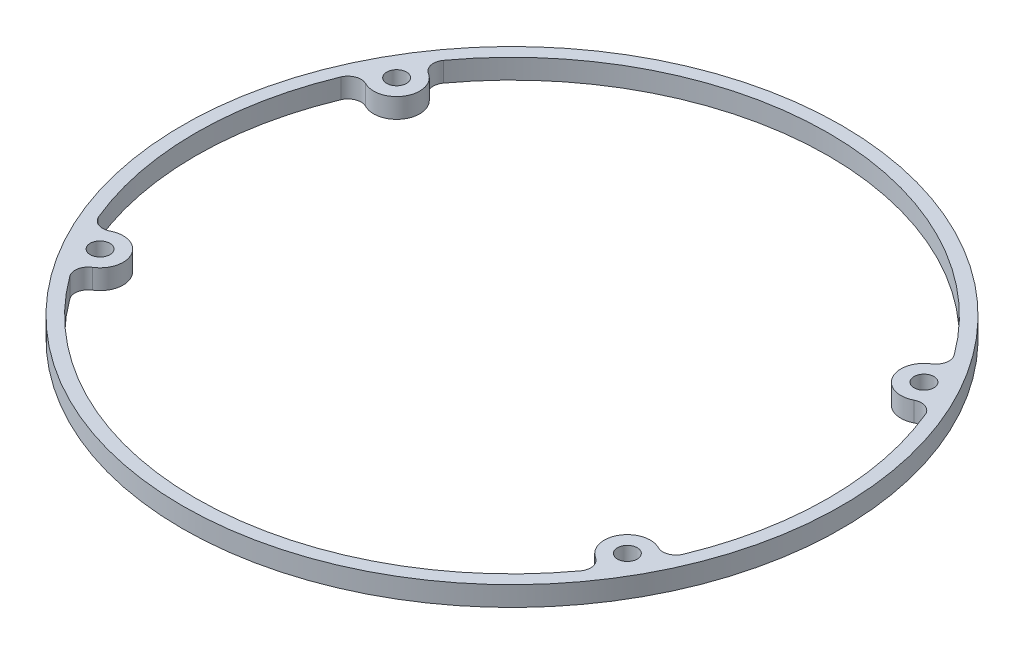
ISO-10303-21;
HEADER;
FILE_DESCRIPTION(('STEP AP214'),'2;1');
FILE_NAME('part.step','',(''),(''),'','','');
FILE_SCHEMA(('AUTOMOTIVE_DESIGN { 1 0 10303 214 1 1 1 1 }'));
ENDSEC;
DATA;
#1=APPLICATION_CONTEXT('core data for automotive mechanical design processes');
#2=APPLICATION_PROTOCOL_DEFINITION('international standard','automotive_design',2000,#1);
#3=PRODUCT_CONTEXT('',#1,'mechanical');
#4=PRODUCT('Part','Part','',(#3));
#5=PRODUCT_RELATED_PRODUCT_CATEGORY('part','',(#4));
#6=PRODUCT_DEFINITION_FORMATION('','',#4);
#7=PRODUCT_DEFINITION_CONTEXT('part definition',#1,'design');
#8=PRODUCT_DEFINITION('design','',#6,#7);
#9=PRODUCT_DEFINITION_SHAPE('','',#8);
#10=(LENGTH_UNIT() NAMED_UNIT(*) SI_UNIT(.MILLI.,.METRE.));
#11=(NAMED_UNIT(*) PLANE_ANGLE_UNIT() SI_UNIT($,.RADIAN.));
#12=(NAMED_UNIT(*) SI_UNIT($,.STERADIAN.) SOLID_ANGLE_UNIT());
#13=UNCERTAINTY_MEASURE_WITH_UNIT(LENGTH_MEASURE(1.E-05),#10,'distance_accuracy_value','');
#14=(GEOMETRIC_REPRESENTATION_CONTEXT(3) GLOBAL_UNCERTAINTY_ASSIGNED_CONTEXT((#13)) GLOBAL_UNIT_ASSIGNED_CONTEXT((#10,
#11,#12)) REPRESENTATION_CONTEXT('',''));
#15=CARTESIAN_POINT('',(0.,0.,0.));
#16=DIRECTION('',(0.,0.,1.));
#17=DIRECTION('',(1.,0.,0.));
#18=AXIS2_PLACEMENT_3D('',#15,#16,#17);
#19=CARTESIAN_POINT('',(0.,3.,0.));
#20=DIRECTION('',(0.,1.,0.));
#21=DIRECTION('',(0.,0.,1.));
#22=AXIS2_PLACEMENT_3D('',#19,#20,#21);
#23=PLANE('',#22);
#24=CARTESIAN_POINT('',(-40.,3.,22.5));
#25=DIRECTION('',(0.,1.,0.));
#26=DIRECTION('',(0.,0.,1.));
#27=AXIS2_PLACEMENT_3D('',#24,#25,#26);
#28=CIRCLE('',#27,1.5);
#29=CARTESIAN_POINT('',(-40.,3.,24.));
#30=VERTEX_POINT('',#29);
#31=EDGE_CURVE('E279',#30,#30,#28,.T.);
#32=ORIENTED_EDGE('',*,*,#31,.F.);
#33=EDGE_LOOP('',(#32));
#34=FACE_BOUND('',#33,.T.);
#35=CARTESIAN_POINT('',(40.,3.,-22.5));
#36=DIRECTION('',(0.,1.,0.));
#37=DIRECTION('',(0.,0.,1.));
#38=AXIS2_PLACEMENT_3D('',#35,#36,#37);
#39=CIRCLE('',#38,1.5);
#40=CARTESIAN_POINT('',(40.,3.,-21.));
#41=VERTEX_POINT('',#40);
#42=EDGE_CURVE('E291',#41,#41,#39,.T.);
#43=ORIENTED_EDGE('',*,*,#42,.F.);
#44=EDGE_LOOP('',(#43));
#45=FACE_BOUND('',#44,.T.);
#46=CARTESIAN_POINT('',(0.,3.,0.));
#47=DIRECTION('',(0.,1.,0.));
#48=DIRECTION('',(0.,0.,1.));
#49=AXIS2_PLACEMENT_3D('',#46,#47,#48);
#50=CIRCLE('',#49,50.);
#51=CARTESIAN_POINT('',(0.,3.,50.));
#52=VERTEX_POINT('',#51);
#53=EDGE_CURVE('E11',#52,#52,#50,.T.);
#54=ORIENTED_EDGE('',*,*,#53,.T.);
#55=EDGE_LOOP('',(#54));
#56=FACE_BOUND('',#55,.T.);
#57=CARTESIAN_POINT('',(-40.,3.,-22.5));
#58=DIRECTION('',(0.,1.,0.));
#59=DIRECTION('',(0.,0.,1.));
#60=AXIS2_PLACEMENT_3D('',#57,#58,#59);
#61=CIRCLE('',#60,1.5);
#62=CARTESIAN_POINT('',(-40.,3.,-21.));
#63=VERTEX_POINT('',#62);
#64=EDGE_CURVE('E297',#63,#63,#61,.T.);
#65=ORIENTED_EDGE('',*,*,#64,.F.);
#66=EDGE_LOOP('',(#65));
#67=FACE_BOUND('',#66,.T.);
#68=CARTESIAN_POINT('',(40.,3.,22.5));
#69=DIRECTION('',(0.,1.,0.));
#70=DIRECTION('',(0.,0.,1.));
#71=AXIS2_PLACEMENT_3D('',#68,#69,#70);
#72=CIRCLE('',#71,1.5);
#73=CARTESIAN_POINT('',(40.,3.,24.));
#74=VERTEX_POINT('',#73);
#75=EDGE_CURVE('E285',#74,#74,#72,.T.);
#76=ORIENTED_EDGE('',*,*,#75,.F.);
#77=EDGE_LOOP('',(#76));
#78=FACE_BOUND('',#77,.T.);
#79=CARTESIAN_POINT('',(37.1111285156196,3.,-27.1802159722318));
#80=DIRECTION('',(0.,-1.,0.));
#81=DIRECTION('',(0.,0.,1.));
#82=AXIS2_PLACEMENT_3D('',#79,#80,#81);
#83=CIRCLE('',#82,2.);
#84=CARTESIAN_POINT('',(38.7246558423857,3.,-28.3619644927636));
#85=VERTEX_POINT('',#84);
#86=CARTESIAN_POINT('',(38.1616272372125,3.,-25.4783192550566));
#87=VERTEX_POINT('',#86);
#88=EDGE_CURVE('E150',#85,#87,#83,.T.);
#89=ORIENTED_EDGE('',*,*,#88,.T.);
#90=CARTESIAN_POINT('',(40.,3.,-22.5));
#91=DIRECTION('',(0.,1.,0.));
#92=DIRECTION('',(0.,0.,-1.));
#93=AXIS2_PLACEMENT_3D('',#90,#91,#92);
#94=CIRCLE('',#93,3.49999999999998);
#95=CARTESIAN_POINT('',(41.5906252580667,3.,-19.382322773538));
#96=VERTEX_POINT('',#95);
#97=EDGE_CURVE('E159',#87,#96,#94,.T.);
#98=ORIENTED_EDGE('',*,*,#97,.T.);
#99=CARTESIAN_POINT('',(42.499553976962,3.,-17.6007929298454));
#100=DIRECTION('',(0.,-1.,0.));
#101=DIRECTION('',(0.,0.,-1.));
#102=AXIS2_PLACEMENT_3D('',#99,#100,#101);
#103=CIRCLE('',#102,2.);
#104=CARTESIAN_POINT('',(44.3473606716125,3.,-18.3660447963604));
#105=VERTEX_POINT('',#104);
#106=EDGE_CURVE('E50',#96,#105,#103,.T.);
#107=ORIENTED_EDGE('',*,*,#106,.T.);
#108=CARTESIAN_POINT('',(0.,3.,0.));
#109=DIRECTION('',(0.,-1.,0.));
#110=DIRECTION('',(0.,0.,-1.));
#111=AXIS2_PLACEMENT_3D('',#108,#109,#110);
#112=CIRCLE('',#111,48.);
#113=CARTESIAN_POINT('',(44.3473606716125,3.,18.3660447963604));
#114=VERTEX_POINT('',#113);
#115=EDGE_CURVE('E172',#105,#114,#112,.T.);
#116=ORIENTED_EDGE('',*,*,#115,.T.);
#117=CARTESIAN_POINT('',(42.499553976962,3.,17.6007929298454));
#118=DIRECTION('',(0.,-1.,0.));
#119=DIRECTION('',(0.,0.,1.));
#120=AXIS2_PLACEMENT_3D('',#117,#118,#119);
#121=CIRCLE('',#120,2.);
#122=CARTESIAN_POINT('',(41.5906252580667,3.,19.382322773538));
#123=VERTEX_POINT('',#122);
#124=EDGE_CURVE('E175',#114,#123,#121,.T.);
#125=ORIENTED_EDGE('',*,*,#124,.T.);
#126=CARTESIAN_POINT('',(40.,3.,22.5));
#127=DIRECTION('',(0.,1.,0.));
#128=DIRECTION('',(0.,0.,-1.));
#129=AXIS2_PLACEMENT_3D('',#126,#127,#128);
#130=CIRCLE('',#129,3.49999999999998);
#131=CARTESIAN_POINT('',(38.1616272372125,3.,25.4783192550566));
#132=VERTEX_POINT('',#131);
#133=EDGE_CURVE('E178',#123,#132,#130,.T.);
#134=ORIENTED_EDGE('',*,*,#133,.T.);
#135=CARTESIAN_POINT('',(37.1111285156196,3.,27.1802159722318));
#136=DIRECTION('',(0.,-1.,0.));
#137=DIRECTION('',(0.,0.,-1.));
#138=AXIS2_PLACEMENT_3D('',#135,#136,#137);
#139=CIRCLE('',#138,2.);
#140=CARTESIAN_POINT('',(38.7246558423857,3.,28.3619644927636));
#141=VERTEX_POINT('',#140);
#142=EDGE_CURVE('E181',#132,#141,#139,.T.);
#143=ORIENTED_EDGE('',*,*,#142,.T.);
#144=CARTESIAN_POINT('',(0.,3.,0.));
#145=DIRECTION('',(0.,-1.,0.));
#146=DIRECTION('',(0.,0.,-1.));
#147=AXIS2_PLACEMENT_3D('',#144,#145,#146);
#148=CIRCLE('',#147,48.);
#149=CARTESIAN_POINT('',(-38.7246558423857,3.,28.3619644927636));
#150=VERTEX_POINT('',#149);
#151=EDGE_CURVE('E184',#141,#150,#148,.T.);
#152=ORIENTED_EDGE('',*,*,#151,.T.);
#153=CARTESIAN_POINT('',(-37.1111285156196,3.,27.1802159722318));
#154=DIRECTION('',(0.,-1.,0.));
#155=DIRECTION('',(0.,0.,1.));
#156=AXIS2_PLACEMENT_3D('',#153,#154,#155);
#157=CIRCLE('',#156,2.);
#158=CARTESIAN_POINT('',(-38.1616272372125,3.,25.4783192550566));
#159=VERTEX_POINT('',#158);
#160=EDGE_CURVE('E187',#150,#159,#157,.T.);
#161=ORIENTED_EDGE('',*,*,#160,.T.);
#162=CARTESIAN_POINT('',(-40.,3.,22.5));
#163=DIRECTION('',(0.,1.,0.));
#164=DIRECTION('',(0.,0.,-1.));
#165=AXIS2_PLACEMENT_3D('',#162,#163,#164);
#166=CIRCLE('',#165,3.49999999999997);
#167=CARTESIAN_POINT('',(-41.5906252580667,3.,19.382322773538));
#168=VERTEX_POINT('',#167);
#169=EDGE_CURVE('E190',#159,#168,#166,.T.);
#170=ORIENTED_EDGE('',*,*,#169,.T.);
#171=CARTESIAN_POINT('',(-42.499553976962,3.,17.6007929298454));
#172=DIRECTION('',(0.,-1.,0.));
#173=DIRECTION('',(0.,0.,-1.));
#174=AXIS2_PLACEMENT_3D('',#171,#172,#173);
#175=CIRCLE('',#174,2.);
#176=CARTESIAN_POINT('',(-44.3473606716125,3.,18.3660447963604));
#177=VERTEX_POINT('',#176);
#178=EDGE_CURVE('E193',#168,#177,#175,.T.);
#179=ORIENTED_EDGE('',*,*,#178,.T.);
#180=CARTESIAN_POINT('',(0.,3.,0.));
#181=DIRECTION('',(0.,-1.,0.));
#182=DIRECTION('',(0.,0.,-1.));
#183=AXIS2_PLACEMENT_3D('',#180,#181,#182);
#184=CIRCLE('',#183,48.);
#185=CARTESIAN_POINT('',(-44.3473606716125,3.,-18.3660447963604));
#186=VERTEX_POINT('',#185);
#187=EDGE_CURVE('E196',#177,#186,#184,.T.);
#188=ORIENTED_EDGE('',*,*,#187,.T.);
#189=CARTESIAN_POINT('',(-42.499553976962,3.,-17.6007929298454));
#190=DIRECTION('',(0.,-1.,0.));
#191=DIRECTION('',(0.,0.,1.));
#192=AXIS2_PLACEMENT_3D('',#189,#190,#191);
#193=CIRCLE('',#192,2.);
#194=CARTESIAN_POINT('',(-41.5906252580667,3.,-19.382322773538));
#195=VERTEX_POINT('',#194);
#196=EDGE_CURVE('E199',#186,#195,#193,.T.);
#197=ORIENTED_EDGE('',*,*,#196,.T.);
#198=CARTESIAN_POINT('',(-40.,3.,-22.5));
#199=DIRECTION('',(0.,1.,0.));
#200=DIRECTION('',(0.,0.,-1.));
#201=AXIS2_PLACEMENT_3D('',#198,#199,#200);
#202=CIRCLE('',#201,3.49999999999997);
#203=CARTESIAN_POINT('',(-38.1616272372125,3.,-25.4783192550566));
#204=VERTEX_POINT('',#203);
#205=EDGE_CURVE('E202',#195,#204,#202,.T.);
#206=ORIENTED_EDGE('',*,*,#205,.T.);
#207=CARTESIAN_POINT('',(-37.1111285156196,3.,-27.1802159722318));
#208=DIRECTION('',(0.,-1.,0.));
#209=DIRECTION('',(0.,0.,-1.));
#210=AXIS2_PLACEMENT_3D('',#207,#208,#209);
#211=CIRCLE('',#210,2.);
#212=CARTESIAN_POINT('',(-38.7246558423857,3.,-28.3619644927636));
#213=VERTEX_POINT('',#212);
#214=EDGE_CURVE('E205',#204,#213,#211,.T.);
#215=ORIENTED_EDGE('',*,*,#214,.T.);
#216=CARTESIAN_POINT('',(0.,3.,0.));
#217=DIRECTION('',(0.,-1.,0.));
#218=DIRECTION('',(0.,0.,-1.));
#219=AXIS2_PLACEMENT_3D('',#216,#217,#218);
#220=CIRCLE('',#219,48.);
#221=EDGE_CURVE('E156',#213,#85,#220,.T.);
#222=ORIENTED_EDGE('',*,*,#221,.T.);
#223=EDGE_LOOP('',(#89,#98,#107,#116,#125,#134,#143,#152,#161,#170,#179,#188,#197,#206,#215,#222));
#224=FACE_BOUND('',#223,.T.);
#225=ADVANCED_FACE('F35',(#34,#45,#56,#67,#78,#224),#23,.T.);
#226=CARTESIAN_POINT('',(0.,0.,0.));
#227=DIRECTION('',(0.,1.,0.));
#228=DIRECTION('',(0.,0.,1.));
#229=AXIS2_PLACEMENT_3D('',#226,#227,#228);
#230=PLANE('',#229);
#231=CARTESIAN_POINT('',(0.,0.,0.));
#232=DIRECTION('',(0.,1.,0.));
#233=DIRECTION('',(0.,0.,1.));
#234=AXIS2_PLACEMENT_3D('',#231,#232,#233);
#235=CIRCLE('',#234,50.);
#236=CARTESIAN_POINT('',(0.,0.,50.));
#237=VERTEX_POINT('',#236);
#238=EDGE_CURVE('E39',#237,#237,#235,.T.);
#239=ORIENTED_EDGE('',*,*,#238,.F.);
#240=EDGE_LOOP('',(#239));
#241=FACE_BOUND('',#240,.T.);
#242=CARTESIAN_POINT('',(-40.,0.,-22.5));
#243=DIRECTION('',(0.,1.,0.));
#244=DIRECTION('',(0.,0.,1.));
#245=AXIS2_PLACEMENT_3D('',#242,#243,#244);
#246=CIRCLE('',#245,1.5);
#247=CARTESIAN_POINT('',(-40.,0.,-21.));
#248=VERTEX_POINT('',#247);
#249=EDGE_CURVE('E294',#248,#248,#246,.T.);
#250=ORIENTED_EDGE('',*,*,#249,.T.);
#251=EDGE_LOOP('',(#250));
#252=FACE_BOUND('',#251,.T.);
#253=CARTESIAN_POINT('',(40.,0.,-22.5));
#254=DIRECTION('',(0.,1.,0.));
#255=DIRECTION('',(0.,0.,1.));
#256=AXIS2_PLACEMENT_3D('',#253,#254,#255);
#257=CIRCLE('',#256,1.5);
#258=CARTESIAN_POINT('',(40.,0.,-21.));
#259=VERTEX_POINT('',#258);
#260=EDGE_CURVE('E288',#259,#259,#257,.T.);
#261=ORIENTED_EDGE('',*,*,#260,.T.);
#262=EDGE_LOOP('',(#261));
#263=FACE_BOUND('',#262,.T.);
#264=CARTESIAN_POINT('',(40.,0.,22.5));
#265=DIRECTION('',(0.,1.,0.));
#266=DIRECTION('',(0.,0.,1.));
#267=AXIS2_PLACEMENT_3D('',#264,#265,#266);
#268=CIRCLE('',#267,1.5);
#269=CARTESIAN_POINT('',(40.,0.,24.));
#270=VERTEX_POINT('',#269);
#271=EDGE_CURVE('E282',#270,#270,#268,.T.);
#272=ORIENTED_EDGE('',*,*,#271,.T.);
#273=EDGE_LOOP('',(#272));
#274=FACE_BOUND('',#273,.T.);
#275=CARTESIAN_POINT('',(-40.,0.,22.5));
#276=DIRECTION('',(0.,1.,0.));
#277=DIRECTION('',(0.,0.,1.));
#278=AXIS2_PLACEMENT_3D('',#275,#276,#277);
#279=CIRCLE('',#278,1.5);
#280=CARTESIAN_POINT('',(-40.,0.,24.));
#281=VERTEX_POINT('',#280);
#282=EDGE_CURVE('E251',#281,#281,#279,.T.);
#283=ORIENTED_EDGE('',*,*,#282,.T.);
#284=EDGE_LOOP('',(#283));
#285=FACE_BOUND('',#284,.T.);
#286=CARTESIAN_POINT('',(40.,0.,-22.5));
#287=DIRECTION('',(0.,1.,0.));
#288=DIRECTION('',(0.,0.,-1.));
#289=AXIS2_PLACEMENT_3D('',#286,#287,#288);
#290=CIRCLE('',#289,3.49999999999998);
#291=CARTESIAN_POINT('',(38.1616272372125,0.,-25.4783192550566));
#292=VERTEX_POINT('',#291);
#293=CARTESIAN_POINT('',(41.5906252580667,0.,-19.382322773538));
#294=VERTEX_POINT('',#293);
#295=EDGE_CURVE('E209',#292,#294,#290,.T.);
#296=ORIENTED_EDGE('',*,*,#295,.F.);
#297=CARTESIAN_POINT('',(37.1111285156196,0.,-27.1802159722318));
#298=DIRECTION('',(0.,-1.,0.));
#299=DIRECTION('',(0.,0.,1.));
#300=AXIS2_PLACEMENT_3D('',#297,#298,#299);
#301=CIRCLE('',#300,2.);
#302=CARTESIAN_POINT('',(38.7246558423857,0.,-28.3619644927636));
#303=VERTEX_POINT('',#302);
#304=EDGE_CURVE('E58',#303,#292,#301,.T.);
#305=ORIENTED_EDGE('',*,*,#304,.F.);
#306=CARTESIAN_POINT('',(0.,0.,0.));
#307=DIRECTION('',(0.,-1.,0.));
#308=DIRECTION('',(0.,0.,-1.));
#309=AXIS2_PLACEMENT_3D('',#306,#307,#308);
#310=CIRCLE('',#309,48.);
#311=CARTESIAN_POINT('',(-38.7246558423857,0.,-28.3619644927636));
#312=VERTEX_POINT('',#311);
#313=EDGE_CURVE('E165',#312,#303,#310,.T.);
#314=ORIENTED_EDGE('',*,*,#313,.F.);
#315=CARTESIAN_POINT('',(-37.1111285156196,0.,-27.1802159722318));
#316=DIRECTION('',(0.,-1.,0.));
#317=DIRECTION('',(0.,0.,-1.));
#318=AXIS2_PLACEMENT_3D('',#315,#316,#317);
#319=CIRCLE('',#318,2.);
#320=CARTESIAN_POINT('',(-38.1616272372125,0.,-25.4783192550566));
#321=VERTEX_POINT('',#320);
#322=EDGE_CURVE('E168',#321,#312,#319,.T.);
#323=ORIENTED_EDGE('',*,*,#322,.F.);
#324=CARTESIAN_POINT('',(-40.,0.,-22.5));
#325=DIRECTION('',(0.,1.,0.));
#326=DIRECTION('',(0.,0.,-1.));
#327=AXIS2_PLACEMENT_3D('',#324,#325,#326);
#328=CIRCLE('',#327,3.49999999999997);
#329=CARTESIAN_POINT('',(-41.5906252580667,0.,-19.382322773538));
#330=VERTEX_POINT('',#329);
#331=EDGE_CURVE('E244',#330,#321,#328,.T.);
#332=ORIENTED_EDGE('',*,*,#331,.F.);
#333=CARTESIAN_POINT('',(-42.499553976962,0.,-17.6007929298454));
#334=DIRECTION('',(0.,-1.,0.));
#335=DIRECTION('',(0.,0.,1.));
#336=AXIS2_PLACEMENT_3D('',#333,#334,#335);
#337=CIRCLE('',#336,2.);
#338=CARTESIAN_POINT('',(-44.3473606716125,0.,-18.3660447963604));
#339=VERTEX_POINT('',#338);
#340=EDGE_CURVE('E241',#339,#330,#337,.T.);
#341=ORIENTED_EDGE('',*,*,#340,.F.);
#342=CARTESIAN_POINT('',(0.,0.,0.));
#343=DIRECTION('',(0.,-1.,0.));
#344=DIRECTION('',(0.,0.,-1.));
#345=AXIS2_PLACEMENT_3D('',#342,#343,#344);
#346=CIRCLE('',#345,48.);
#347=CARTESIAN_POINT('',(-44.3473606716125,0.,18.3660447963604));
#348=VERTEX_POINT('',#347);
#349=EDGE_CURVE('E238',#348,#339,#346,.T.);
#350=ORIENTED_EDGE('',*,*,#349,.F.);
#351=CARTESIAN_POINT('',(-42.499553976962,0.,17.6007929298454));
#352=DIRECTION('',(0.,-1.,0.));
#353=DIRECTION('',(0.,0.,-1.));
#354=AXIS2_PLACEMENT_3D('',#351,#352,#353);
#355=CIRCLE('',#354,2.);
#356=CARTESIAN_POINT('',(-41.5906252580667,0.,19.382322773538));
#357=VERTEX_POINT('',#356);
#358=EDGE_CURVE('E235',#357,#348,#355,.T.);
#359=ORIENTED_EDGE('',*,*,#358,.F.);
#360=CARTESIAN_POINT('',(-40.,0.,22.5));
#361=DIRECTION('',(0.,1.,0.));
#362=DIRECTION('',(0.,0.,-1.));
#363=AXIS2_PLACEMENT_3D('',#360,#361,#362);
#364=CIRCLE('',#363,3.49999999999997);
#365=CARTESIAN_POINT('',(-38.1616272372125,0.,25.4783192550566));
#366=VERTEX_POINT('',#365);
#367=EDGE_CURVE('E232',#366,#357,#364,.T.);
#368=ORIENTED_EDGE('',*,*,#367,.F.);
#369=CARTESIAN_POINT('',(-37.1111285156196,0.,27.1802159722318));
#370=DIRECTION('',(0.,-1.,0.));
#371=DIRECTION('',(0.,0.,1.));
#372=AXIS2_PLACEMENT_3D('',#369,#370,#371);
#373=CIRCLE('',#372,2.);
#374=CARTESIAN_POINT('',(-38.7246558423857,0.,28.3619644927636));
#375=VERTEX_POINT('',#374);
#376=EDGE_CURVE('E229',#375,#366,#373,.T.);
#377=ORIENTED_EDGE('',*,*,#376,.F.);
#378=CARTESIAN_POINT('',(0.,0.,0.));
#379=DIRECTION('',(0.,-1.,0.));
#380=DIRECTION('',(0.,0.,-1.));
#381=AXIS2_PLACEMENT_3D('',#378,#379,#380);
#382=CIRCLE('',#381,48.);
#383=CARTESIAN_POINT('',(38.7246558423857,0.,28.3619644927636));
#384=VERTEX_POINT('',#383);
#385=EDGE_CURVE('E226',#384,#375,#382,.T.);
#386=ORIENTED_EDGE('',*,*,#385,.F.);
#387=CARTESIAN_POINT('',(37.1111285156196,0.,27.1802159722318));
#388=DIRECTION('',(0.,-1.,0.));
#389=DIRECTION('',(0.,0.,-1.));
#390=AXIS2_PLACEMENT_3D('',#387,#388,#389);
#391=CIRCLE('',#390,2.);
#392=CARTESIAN_POINT('',(38.1616272372125,0.,25.4783192550566));
#393=VERTEX_POINT('',#392);
#394=EDGE_CURVE('E223',#393,#384,#391,.T.);
#395=ORIENTED_EDGE('',*,*,#394,.F.);
#396=CARTESIAN_POINT('',(40.,0.,22.5));
#397=DIRECTION('',(0.,1.,0.));
#398=DIRECTION('',(0.,0.,-1.));
#399=AXIS2_PLACEMENT_3D('',#396,#397,#398);
#400=CIRCLE('',#399,3.49999999999998);
#401=CARTESIAN_POINT('',(41.5906252580667,0.,19.382322773538));
#402=VERTEX_POINT('',#401);
#403=EDGE_CURVE('E220',#402,#393,#400,.T.);
#404=ORIENTED_EDGE('',*,*,#403,.F.);
#405=CARTESIAN_POINT('',(42.499553976962,0.,17.6007929298454));
#406=DIRECTION('',(0.,-1.,0.));
#407=DIRECTION('',(0.,0.,1.));
#408=AXIS2_PLACEMENT_3D('',#405,#406,#407);
#409=CIRCLE('',#408,2.);
#410=CARTESIAN_POINT('',(44.3473606716125,0.,18.3660447963604));
#411=VERTEX_POINT('',#410);
#412=EDGE_CURVE('E217',#411,#402,#409,.T.);
#413=ORIENTED_EDGE('',*,*,#412,.F.);
#414=CARTESIAN_POINT('',(0.,0.,0.));
#415=DIRECTION('',(0.,-1.,0.));
#416=DIRECTION('',(0.,0.,-1.));
#417=AXIS2_PLACEMENT_3D('',#414,#415,#416);
#418=CIRCLE('',#417,48.);
#419=CARTESIAN_POINT('',(44.3473606716125,0.,-18.3660447963604));
#420=VERTEX_POINT('',#419);
#421=EDGE_CURVE('E214',#420,#411,#418,.T.);
#422=ORIENTED_EDGE('',*,*,#421,.F.);
#423=CARTESIAN_POINT('',(42.499553976962,0.,-17.6007929298454));
#424=DIRECTION('',(0.,-1.,0.));
#425=DIRECTION('',(0.,0.,-1.));
#426=AXIS2_PLACEMENT_3D('',#423,#424,#425);
#427=CIRCLE('',#426,2.);
#428=EDGE_CURVE('E211',#294,#420,#427,.T.);
#429=ORIENTED_EDGE('',*,*,#428,.F.);
#430=EDGE_LOOP('',(#296,#305,#314,#323,#332,#341,#350,#359,#368,#377,#386,#395,#404,#413,#422,#429));
#431=FACE_BOUND('',#430,.T.);
#432=ADVANCED_FACE('F303',(#241,#252,#263,#274,#285,#431),#230,.F.);
#433=CARTESIAN_POINT('',(0.,3.,0.));
#434=DIRECTION('',(0.,-1.,0.));
#435=DIRECTION('',(0.,0.,-1.));
#436=AXIS2_PLACEMENT_3D('',#433,#434,#435);
#437=CYLINDRICAL_SURFACE('',#436,50.);
#438=ORIENTED_EDGE('',*,*,#53,.F.);
#439=EDGE_LOOP('',(#438));
#440=FACE_BOUND('',#439,.T.);
#441=ORIENTED_EDGE('',*,*,#238,.T.);
#442=EDGE_LOOP('',(#441));
#443=FACE_BOUND('',#442,.T.);
#444=ADVANCED_FACE('F37',(#440,#443),#437,.T.);
#445=CARTESIAN_POINT('',(-40.,3.,-22.5));
#446=DIRECTION('',(0.,-1.,0.));
#447=DIRECTION('',(0.,0.,-1.));
#448=AXIS2_PLACEMENT_3D('',#445,#446,#447);
#449=CYLINDRICAL_SURFACE('',#448,1.5);
#450=ORIENTED_EDGE('',*,*,#64,.T.);
#451=EDGE_LOOP('',(#450));
#452=FACE_BOUND('',#451,.T.);
#453=ORIENTED_EDGE('',*,*,#249,.F.);
#454=EDGE_LOOP('',(#453));
#455=FACE_BOUND('',#454,.T.);
#456=ADVANCED_FACE('F306',(#452,#455),#449,.F.);
#457=CARTESIAN_POINT('',(40.,3.,-22.5));
#458=DIRECTION('',(0.,-1.,0.));
#459=DIRECTION('',(0.,0.,-1.));
#460=AXIS2_PLACEMENT_3D('',#457,#458,#459);
#461=CYLINDRICAL_SURFACE('',#460,1.5);
#462=ORIENTED_EDGE('',*,*,#42,.T.);
#463=EDGE_LOOP('',(#462));
#464=FACE_BOUND('',#463,.T.);
#465=ORIENTED_EDGE('',*,*,#260,.F.);
#466=EDGE_LOOP('',(#465));
#467=FACE_BOUND('',#466,.T.);
#468=ADVANCED_FACE('F308',(#464,#467),#461,.F.);
#469=CARTESIAN_POINT('',(40.,3.,22.5));
#470=DIRECTION('',(0.,-1.,0.));
#471=DIRECTION('',(0.,0.,-1.));
#472=AXIS2_PLACEMENT_3D('',#469,#470,#471);
#473=CYLINDRICAL_SURFACE('',#472,1.5);
#474=ORIENTED_EDGE('',*,*,#75,.T.);
#475=EDGE_LOOP('',(#474));
#476=FACE_BOUND('',#475,.T.);
#477=ORIENTED_EDGE('',*,*,#271,.F.);
#478=EDGE_LOOP('',(#477));
#479=FACE_BOUND('',#478,.T.);
#480=ADVANCED_FACE('F315',(#476,#479),#473,.F.);
#481=CARTESIAN_POINT('',(-40.,3.,22.5));
#482=DIRECTION('',(0.,-1.,0.));
#483=DIRECTION('',(0.,0.,-1.));
#484=AXIS2_PLACEMENT_3D('',#481,#482,#483);
#485=CYLINDRICAL_SURFACE('',#484,1.5);
#486=ORIENTED_EDGE('',*,*,#31,.T.);
#487=EDGE_LOOP('',(#486));
#488=FACE_BOUND('',#487,.T.);
#489=ORIENTED_EDGE('',*,*,#282,.F.);
#490=EDGE_LOOP('',(#489));
#491=FACE_BOUND('',#490,.T.);
#492=ADVANCED_FACE('F338',(#488,#491),#485,.F.);
#493=CARTESIAN_POINT('',(37.1111285156196,3.,-27.1802159722318));
#494=DIRECTION('',(0.,-1.,0.));
#495=DIRECTION('',(0.,0.,-1.));
#496=AXIS2_PLACEMENT_3D('',#493,#494,#495);
#497=CYLINDRICAL_SURFACE('',#496,2.);
#498=ORIENTED_EDGE('',*,*,#304,.T.);
#499=DIRECTION('',(0.,-1.,0.));
#500=VECTOR('',#499,1.);
#501=CARTESIAN_POINT('',(38.1616272372125,3.,-25.4783192550566));
#502=LINE('',#501,#500);
#503=EDGE_CURVE('E146',#87,#292,#502,.T.);
#504=ORIENTED_EDGE('',*,*,#503,.F.);
#505=ORIENTED_EDGE('',*,*,#88,.F.);
#506=DIRECTION('',(0.,-1.,0.));
#507=VECTOR('',#506,1.);
#508=CARTESIAN_POINT('',(38.7246558423857,3.,-28.3619644927636));
#509=LINE('',#508,#507);
#510=EDGE_CURVE('E249',#85,#303,#509,.T.);
#511=ORIENTED_EDGE('',*,*,#510,.T.);
#512=EDGE_LOOP('',(#498,#504,#505,#511));
#513=FACE_BOUND('',#512,.T.);
#514=ADVANCED_FACE('F148',(#513),#497,.F.);
#515=CARTESIAN_POINT('',(0.,3.,0.));
#516=DIRECTION('',(0.,-1.,0.));
#517=DIRECTION('',(0.,0.,-1.));
#518=AXIS2_PLACEMENT_3D('',#515,#516,#517);
#519=CYLINDRICAL_SURFACE('',#518,48.);
#520=ORIENTED_EDGE('',*,*,#313,.T.);
#521=ORIENTED_EDGE('',*,*,#510,.F.);
#522=ORIENTED_EDGE('',*,*,#221,.F.);
#523=DIRECTION('',(0.,-1.,0.));
#524=VECTOR('',#523,1.);
#525=CARTESIAN_POINT('',(-38.7246558423857,3.,-28.3619644927636));
#526=LINE('',#525,#524);
#527=EDGE_CURVE('E252',#213,#312,#526,.T.);
#528=ORIENTED_EDGE('',*,*,#527,.T.);
#529=EDGE_LOOP('',(#520,#521,#522,#528));
#530=FACE_BOUND('',#529,.T.);
#531=ADVANCED_FACE('F397',(#530),#519,.F.);
#532=CARTESIAN_POINT('',(-37.1111285156196,3.,-27.1802159722318));
#533=DIRECTION('',(0.,-1.,0.));
#534=DIRECTION('',(0.,0.,-1.));
#535=AXIS2_PLACEMENT_3D('',#532,#533,#534);
#536=CYLINDRICAL_SURFACE('',#535,2.);
#537=ORIENTED_EDGE('',*,*,#322,.T.);
#538=ORIENTED_EDGE('',*,*,#527,.F.);
#539=ORIENTED_EDGE('',*,*,#214,.F.);
#540=DIRECTION('',(0.,-1.,0.));
#541=VECTOR('',#540,1.);
#542=CARTESIAN_POINT('',(-38.1616272372125,3.,-25.4783192550566));
#543=LINE('',#542,#541);
#544=EDGE_CURVE('E254',#204,#321,#543,.T.);
#545=ORIENTED_EDGE('',*,*,#544,.T.);
#546=EDGE_LOOP('',(#537,#538,#539,#545));
#547=FACE_BOUND('',#546,.T.);
#548=ADVANCED_FACE('F395',(#547),#536,.F.);
#549=CARTESIAN_POINT('',(-40.,3.,-22.5));
#550=DIRECTION('',(0.,-1.,0.));
#551=DIRECTION('',(0.,0.,-1.));
#552=AXIS2_PLACEMENT_3D('',#549,#550,#551);
#553=CYLINDRICAL_SURFACE('',#552,3.49999999999997);
#554=ORIENTED_EDGE('',*,*,#331,.T.);
#555=ORIENTED_EDGE('',*,*,#544,.F.);
#556=ORIENTED_EDGE('',*,*,#205,.F.);
#557=DIRECTION('',(0.,-1.,0.));
#558=VECTOR('',#557,1.);
#559=CARTESIAN_POINT('',(-41.5906252580667,3.,-19.382322773538));
#560=LINE('',#559,#558);
#561=EDGE_CURVE('E256',#195,#330,#560,.T.);
#562=ORIENTED_EDGE('',*,*,#561,.T.);
#563=EDGE_LOOP('',(#554,#555,#556,#562));
#564=FACE_BOUND('',#563,.T.);
#565=ADVANCED_FACE('F391',(#564),#553,.T.);
#566=CARTESIAN_POINT('',(-42.499553976962,3.,-17.6007929298454));
#567=DIRECTION('',(0.,-1.,0.));
#568=DIRECTION('',(0.,0.,-1.));
#569=AXIS2_PLACEMENT_3D('',#566,#567,#568);
#570=CYLINDRICAL_SURFACE('',#569,2.);
#571=ORIENTED_EDGE('',*,*,#340,.T.);
#572=ORIENTED_EDGE('',*,*,#561,.F.);
#573=ORIENTED_EDGE('',*,*,#196,.F.);
#574=DIRECTION('',(0.,-1.,0.));
#575=VECTOR('',#574,1.);
#576=CARTESIAN_POINT('',(-44.3473606716125,3.,-18.3660447963604));
#577=LINE('',#576,#575);
#578=EDGE_CURVE('E258',#186,#339,#577,.T.);
#579=ORIENTED_EDGE('',*,*,#578,.T.);
#580=EDGE_LOOP('',(#571,#572,#573,#579));
#581=FACE_BOUND('',#580,.T.);
#582=ADVANCED_FACE('F387',(#581),#570,.F.);
#583=CARTESIAN_POINT('',(0.,3.,0.));
#584=DIRECTION('',(0.,-1.,0.));
#585=DIRECTION('',(0.,0.,-1.));
#586=AXIS2_PLACEMENT_3D('',#583,#584,#585);
#587=CYLINDRICAL_SURFACE('',#586,48.);
#588=ORIENTED_EDGE('',*,*,#349,.T.);
#589=ORIENTED_EDGE('',*,*,#578,.F.);
#590=ORIENTED_EDGE('',*,*,#187,.F.);
#591=DIRECTION('',(0.,-1.,0.));
#592=VECTOR('',#591,1.);
#593=CARTESIAN_POINT('',(-44.3473606716125,3.,18.3660447963604));
#594=LINE('',#593,#592);
#595=EDGE_CURVE('E260',#177,#348,#594,.T.);
#596=ORIENTED_EDGE('',*,*,#595,.T.);
#597=EDGE_LOOP('',(#588,#589,#590,#596));
#598=FACE_BOUND('',#597,.T.);
#599=ADVANCED_FACE('F383',(#598),#587,.F.);
#600=CARTESIAN_POINT('',(-42.499553976962,3.,17.6007929298454));
#601=DIRECTION('',(0.,-1.,0.));
#602=DIRECTION('',(0.,0.,-1.));
#603=AXIS2_PLACEMENT_3D('',#600,#601,#602);
#604=CYLINDRICAL_SURFACE('',#603,2.);
#605=ORIENTED_EDGE('',*,*,#358,.T.);
#606=ORIENTED_EDGE('',*,*,#595,.F.);
#607=ORIENTED_EDGE('',*,*,#178,.F.);
#608=DIRECTION('',(0.,-1.,0.));
#609=VECTOR('',#608,1.);
#610=CARTESIAN_POINT('',(-41.5906252580667,3.,19.382322773538));
#611=LINE('',#610,#609);
#612=EDGE_CURVE('E262',#168,#357,#611,.T.);
#613=ORIENTED_EDGE('',*,*,#612,.T.);
#614=EDGE_LOOP('',(#605,#606,#607,#613));
#615=FACE_BOUND('',#614,.T.);
#616=ADVANCED_FACE('F379',(#615),#604,.F.);
#617=CARTESIAN_POINT('',(-40.,3.,22.5));
#618=DIRECTION('',(0.,-1.,0.));
#619=DIRECTION('',(0.,0.,-1.));
#620=AXIS2_PLACEMENT_3D('',#617,#618,#619);
#621=CYLINDRICAL_SURFACE('',#620,3.49999999999997);
#622=ORIENTED_EDGE('',*,*,#367,.T.);
#623=ORIENTED_EDGE('',*,*,#612,.F.);
#624=ORIENTED_EDGE('',*,*,#169,.F.);
#625=DIRECTION('',(0.,-1.,0.));
#626=VECTOR('',#625,1.);
#627=CARTESIAN_POINT('',(-38.1616272372125,3.,25.4783192550566));
#628=LINE('',#627,#626);
#629=EDGE_CURVE('E264',#159,#366,#628,.T.);
#630=ORIENTED_EDGE('',*,*,#629,.T.);
#631=EDGE_LOOP('',(#622,#623,#624,#630));
#632=FACE_BOUND('',#631,.T.);
#633=ADVANCED_FACE('F375',(#632),#621,.T.);
#634=CARTESIAN_POINT('',(-37.1111285156196,3.,27.1802159722318));
#635=DIRECTION('',(0.,-1.,0.));
#636=DIRECTION('',(0.,0.,-1.));
#637=AXIS2_PLACEMENT_3D('',#634,#635,#636);
#638=CYLINDRICAL_SURFACE('',#637,2.);
#639=ORIENTED_EDGE('',*,*,#376,.T.);
#640=ORIENTED_EDGE('',*,*,#629,.F.);
#641=ORIENTED_EDGE('',*,*,#160,.F.);
#642=DIRECTION('',(0.,-1.,0.));
#643=VECTOR('',#642,1.);
#644=CARTESIAN_POINT('',(-38.7246558423857,3.,28.3619644927636));
#645=LINE('',#644,#643);
#646=EDGE_CURVE('E266',#150,#375,#645,.T.);
#647=ORIENTED_EDGE('',*,*,#646,.T.);
#648=EDGE_LOOP('',(#639,#640,#641,#647));
#649=FACE_BOUND('',#648,.T.);
#650=ADVANCED_FACE('F371',(#649),#638,.F.);
#651=CARTESIAN_POINT('',(0.,3.,0.));
#652=DIRECTION('',(0.,-1.,0.));
#653=DIRECTION('',(0.,0.,-1.));
#654=AXIS2_PLACEMENT_3D('',#651,#652,#653);
#655=CYLINDRICAL_SURFACE('',#654,48.);
#656=ORIENTED_EDGE('',*,*,#385,.T.);
#657=ORIENTED_EDGE('',*,*,#646,.F.);
#658=ORIENTED_EDGE('',*,*,#151,.F.);
#659=DIRECTION('',(0.,-1.,0.));
#660=VECTOR('',#659,1.);
#661=CARTESIAN_POINT('',(38.7246558423857,3.,28.3619644927636));
#662=LINE('',#661,#660);
#663=EDGE_CURVE('E268',#141,#384,#662,.T.);
#664=ORIENTED_EDGE('',*,*,#663,.T.);
#665=EDGE_LOOP('',(#656,#657,#658,#664));
#666=FACE_BOUND('',#665,.T.);
#667=ADVANCED_FACE('F367',(#666),#655,.F.);
#668=CARTESIAN_POINT('',(37.1111285156196,3.,27.1802159722318));
#669=DIRECTION('',(0.,-1.,0.));
#670=DIRECTION('',(0.,0.,-1.));
#671=AXIS2_PLACEMENT_3D('',#668,#669,#670);
#672=CYLINDRICAL_SURFACE('',#671,2.);
#673=ORIENTED_EDGE('',*,*,#394,.T.);
#674=ORIENTED_EDGE('',*,*,#663,.F.);
#675=ORIENTED_EDGE('',*,*,#142,.F.);
#676=DIRECTION('',(0.,-1.,0.));
#677=VECTOR('',#676,1.);
#678=CARTESIAN_POINT('',(38.1616272372125,3.,25.4783192550566));
#679=LINE('',#678,#677);
#680=EDGE_CURVE('E270',#132,#393,#679,.T.);
#681=ORIENTED_EDGE('',*,*,#680,.T.);
#682=EDGE_LOOP('',(#673,#674,#675,#681));
#683=FACE_BOUND('',#682,.T.);
#684=ADVANCED_FACE('F363',(#683),#672,.F.);
#685=CARTESIAN_POINT('',(40.,3.,22.5));
#686=DIRECTION('',(0.,-1.,0.));
#687=DIRECTION('',(0.,0.,-1.));
#688=AXIS2_PLACEMENT_3D('',#685,#686,#687);
#689=CYLINDRICAL_SURFACE('',#688,3.49999999999998);
#690=ORIENTED_EDGE('',*,*,#403,.T.);
#691=ORIENTED_EDGE('',*,*,#680,.F.);
#692=ORIENTED_EDGE('',*,*,#133,.F.);
#693=DIRECTION('',(0.,-1.,0.));
#694=VECTOR('',#693,1.);
#695=CARTESIAN_POINT('',(41.5906252580667,3.,19.382322773538));
#696=LINE('',#695,#694);
#697=EDGE_CURVE('E272',#123,#402,#696,.T.);
#698=ORIENTED_EDGE('',*,*,#697,.T.);
#699=EDGE_LOOP('',(#690,#691,#692,#698));
#700=FACE_BOUND('',#699,.T.);
#701=ADVANCED_FACE('F359',(#700),#689,.T.);
#702=CARTESIAN_POINT('',(42.499553976962,3.,17.6007929298454));
#703=DIRECTION('',(0.,-1.,0.));
#704=DIRECTION('',(0.,0.,-1.));
#705=AXIS2_PLACEMENT_3D('',#702,#703,#704);
#706=CYLINDRICAL_SURFACE('',#705,2.);
#707=ORIENTED_EDGE('',*,*,#412,.T.);
#708=ORIENTED_EDGE('',*,*,#697,.F.);
#709=ORIENTED_EDGE('',*,*,#124,.F.);
#710=DIRECTION('',(0.,-1.,0.));
#711=VECTOR('',#710,1.);
#712=CARTESIAN_POINT('',(44.3473606716125,3.,18.3660447963604));
#713=LINE('',#712,#711);
#714=EDGE_CURVE('E274',#114,#411,#713,.T.);
#715=ORIENTED_EDGE('',*,*,#714,.T.);
#716=EDGE_LOOP('',(#707,#708,#709,#715));
#717=FACE_BOUND('',#716,.T.);
#718=ADVANCED_FACE('F356',(#717),#706,.F.);
#719=CARTESIAN_POINT('',(0.,3.,0.));
#720=DIRECTION('',(0.,-1.,0.));
#721=DIRECTION('',(0.,0.,-1.));
#722=AXIS2_PLACEMENT_3D('',#719,#720,#721);
#723=CYLINDRICAL_SURFACE('',#722,48.);
#724=ORIENTED_EDGE('',*,*,#421,.T.);
#725=ORIENTED_EDGE('',*,*,#714,.F.);
#726=ORIENTED_EDGE('',*,*,#115,.F.);
#727=DIRECTION('',(0.,-1.,0.));
#728=VECTOR('',#727,1.);
#729=CARTESIAN_POINT('',(44.3473606716125,3.,-18.3660447963604));
#730=LINE('',#729,#728);
#731=EDGE_CURVE('E276',#105,#420,#730,.T.);
#732=ORIENTED_EDGE('',*,*,#731,.T.);
#733=EDGE_LOOP('',(#724,#725,#726,#732));
#734=FACE_BOUND('',#733,.T.);
#735=ADVANCED_FACE('F352',(#734),#723,.F.);
#736=CARTESIAN_POINT('',(42.499553976962,3.,-17.6007929298454));
#737=DIRECTION('',(0.,-1.,0.));
#738=DIRECTION('',(0.,0.,-1.));
#739=AXIS2_PLACEMENT_3D('',#736,#737,#738);
#740=CYLINDRICAL_SURFACE('',#739,2.);
#741=ORIENTED_EDGE('',*,*,#428,.T.);
#742=ORIENTED_EDGE('',*,*,#731,.F.);
#743=ORIENTED_EDGE('',*,*,#106,.F.);
#744=DIRECTION('',(0.,-1.,0.));
#745=VECTOR('',#744,1.);
#746=CARTESIAN_POINT('',(41.5906252580667,3.,-19.382322773538));
#747=LINE('',#746,#745);
#748=EDGE_CURVE('E155',#96,#294,#747,.T.);
#749=ORIENTED_EDGE('',*,*,#748,.T.);
#750=EDGE_LOOP('',(#741,#742,#743,#749));
#751=FACE_BOUND('',#750,.T.);
#752=ADVANCED_FACE('F349',(#751),#740,.F.);
#753=CARTESIAN_POINT('',(40.,3.,-22.5));
#754=DIRECTION('',(0.,-1.,0.));
#755=DIRECTION('',(0.,0.,-1.));
#756=AXIS2_PLACEMENT_3D('',#753,#754,#755);
#757=CYLINDRICAL_SURFACE('',#756,3.49999999999998);
#758=ORIENTED_EDGE('',*,*,#295,.T.);
#759=ORIENTED_EDGE('',*,*,#748,.F.);
#760=ORIENTED_EDGE('',*,*,#97,.F.);
#761=ORIENTED_EDGE('',*,*,#503,.T.);
#762=EDGE_LOOP('',(#758,#759,#760,#761));
#763=FACE_BOUND('',#762,.T.);
#764=ADVANCED_FACE('F160',(#763),#757,.T.);
#765=CLOSED_SHELL('',(#225,#432,#444,#456,#468,#480,#492,#514,#531,#548,#565,#582,#599,#616,
#633,#650,#667,#684,#701,#718,#735,#752,#764));
#766=MANIFOLD_SOLID_BREP('B2',#765);
#767=ADVANCED_BREP_SHAPE_REPRESENTATION('',(#18,#766),#14);
#768=SHAPE_DEFINITION_REPRESENTATION(#9,#767);
ENDSEC;
END-ISO-10303-21;
